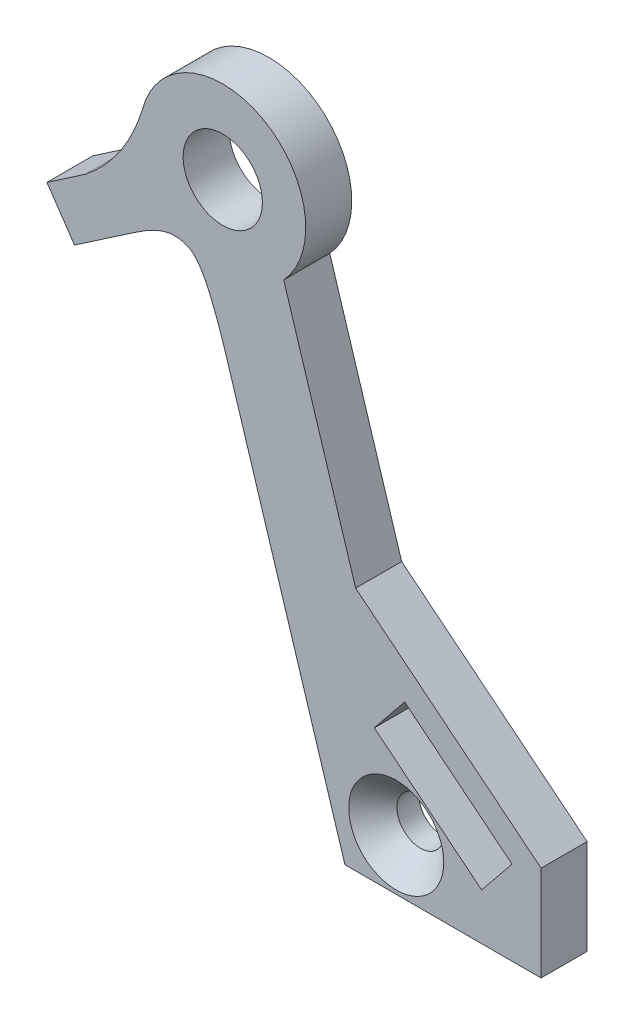
ISO-10303-21;
HEADER;
FILE_DESCRIPTION(('STEP AP214'),'2;1');
FILE_NAME('part.step','',(''),(''),'','','');
FILE_SCHEMA(('AUTOMOTIVE_DESIGN { 1 0 10303 214 1 1 1 1 }'));
ENDSEC;
DATA;
#1=APPLICATION_CONTEXT('core data for automotive mechanical design processes');
#2=APPLICATION_PROTOCOL_DEFINITION('international standard','automotive_design',2000,#1);
#3=PRODUCT_CONTEXT('',#1,'mechanical');
#4=PRODUCT('Part','Part','',(#3));
#5=PRODUCT_RELATED_PRODUCT_CATEGORY('part','',(#4));
#6=PRODUCT_DEFINITION_FORMATION('','',#4);
#7=PRODUCT_DEFINITION_CONTEXT('part definition',#1,'design');
#8=PRODUCT_DEFINITION('design','',#6,#7);
#9=PRODUCT_DEFINITION_SHAPE('','',#8);
#10=(LENGTH_UNIT() NAMED_UNIT(*) SI_UNIT(.MILLI.,.METRE.));
#11=(NAMED_UNIT(*) PLANE_ANGLE_UNIT() SI_UNIT($,.RADIAN.));
#12=(NAMED_UNIT(*) SI_UNIT($,.STERADIAN.) SOLID_ANGLE_UNIT());
#13=UNCERTAINTY_MEASURE_WITH_UNIT(LENGTH_MEASURE(1.E-05),#10,'distance_accuracy_value','');
#14=(GEOMETRIC_REPRESENTATION_CONTEXT(3) GLOBAL_UNCERTAINTY_ASSIGNED_CONTEXT((#13)) GLOBAL_UNIT_ASSIGNED_CONTEXT((#10,
#11,#12)) REPRESENTATION_CONTEXT('',''));
#15=CARTESIAN_POINT('',(0.,0.,0.));
#16=DIRECTION('',(0.,0.,1.));
#17=DIRECTION('',(1.,0.,0.));
#18=AXIS2_PLACEMENT_3D('',#15,#16,#17);
#19=CARTESIAN_POINT('',(7.09605122151095,8.7855872266326,3.05));
#20=DIRECTION('',(0.628337107087621,0.777941180203721,0.));
#21=DIRECTION('',(-0.777941180203721,0.628337107087621,0.));
#22=AXIS2_PLACEMENT_3D('',#19,#20,#21);
#23=PLANE('',#22);
#24=DIRECTION('',(0.777941180203722,-0.628337107087621,0.));
#25=VECTOR('',#24,1.);
#26=CARTESIAN_POINT('',(7.09605122151095,8.7855872266326,0.));
#27=LINE('',#26,#25);
#28=CARTESIAN_POINT('',(3.95568575976615,11.3220362534265,0.));
#29=VERTEX_POINT('',#28);
#30=CARTESIAN_POINT('',(11.0738475586302,5.57275172357473,0.));
#31=VERTEX_POINT('',#30);
#32=EDGE_CURVE('E218',#29,#31,#27,.T.);
#33=ORIENTED_EDGE('',*,*,#32,.T.);
#34=DIRECTION('',(0.,0.,-1.));
#35=VECTOR('',#34,1.);
#36=CARTESIAN_POINT('',(11.0738475586302,5.57275172357473,3.05));
#37=LINE('',#36,#35);
#38=CARTESIAN_POINT('',(11.0738475586302,5.57275172357473,3.05));
#39=VERTEX_POINT('',#38);
#40=EDGE_CURVE('E12',#39,#31,#37,.T.);
#41=ORIENTED_EDGE('',*,*,#40,.F.);
#42=DIRECTION('',(0.777941180203722,-0.628337107087621,0.));
#43=VECTOR('',#42,1.);
#44=CARTESIAN_POINT('',(7.09605122151095,8.7855872266326,3.05));
#45=LINE('',#44,#43);
#46=CARTESIAN_POINT('',(3.95568575976615,11.3220362534265,3.05));
#47=VERTEX_POINT('',#46);
#48=EDGE_CURVE('E183',#47,#39,#45,.T.);
#49=ORIENTED_EDGE('',*,*,#48,.F.);
#50=DIRECTION('',(0.,0.,-1.));
#51=VECTOR('',#50,1.);
#52=CARTESIAN_POINT('',(3.95568575976615,11.3220362534265,3.05));
#53=LINE('',#52,#51);
#54=EDGE_CURVE('E237',#47,#29,#53,.T.);
#55=ORIENTED_EDGE('',*,*,#54,.T.);
#56=EDGE_LOOP('',(#33,#41,#49,#55));
#57=FACE_BOUND('',#56,.T.);
#58=ADVANCED_FACE('F48',(#57),#23,.F.);
#59=CARTESIAN_POINT('',(3.97779633711926,-3.21283550305786,3.05));
#60=DIRECTION('',(-0.777941180203721,0.628337107087621,0.));
#61=DIRECTION('',(-0.628337107087621,-0.777941180203721,0.));
#62=AXIS2_PLACEMENT_3D('',#59,#60,#61);
#63=PLANE('',#62);
#64=DIRECTION('',(0.628337107087621,0.777941180203721,0.));
#65=VECTOR('',#64,1.);
#66=CARTESIAN_POINT('',(3.97779633711926,-3.21283550305786,0.));
#67=LINE('',#66,#65);
#68=CARTESIAN_POINT('',(9.06316881594982,3.08333994692283,0.));
#69=VERTEX_POINT('',#68);
#70=EDGE_CURVE('E173',#69,#31,#67,.T.);
#71=ORIENTED_EDGE('',*,*,#70,.F.);
#72=DIRECTION('',(0.,0.,-1.));
#73=VECTOR('',#72,1.);
#74=CARTESIAN_POINT('',(9.06316881594982,3.08333994692283,3.05));
#75=LINE('',#74,#73);
#76=CARTESIAN_POINT('',(9.06316881594982,3.08333994692283,3.05));
#77=VERTEX_POINT('',#76);
#78=EDGE_CURVE('E59',#77,#69,#75,.T.);
#79=ORIENTED_EDGE('',*,*,#78,.F.);
#80=DIRECTION('',(0.628337107087621,0.777941180203721,0.));
#81=VECTOR('',#80,1.);
#82=CARTESIAN_POINT('',(3.97779633711926,-3.21283550305786,3.05));
#83=LINE('',#82,#81);
#84=EDGE_CURVE('E171',#77,#39,#83,.T.);
#85=ORIENTED_EDGE('',*,*,#84,.T.);
#86=ORIENTED_EDGE('',*,*,#40,.T.);
#87=EDGE_LOOP('',(#71,#79,#85,#86));
#88=FACE_BOUND('',#87,.T.);
#89=ADVANCED_FACE('F169',(#88),#63,.T.);
#90=CARTESIAN_POINT('',(5.08537247883056,6.29617544998069,3.05));
#91=DIRECTION('',(-0.628337107087621,-0.777941180203721,0.));
#92=DIRECTION('',(0.777941180203722,-0.628337107087621,0.));
#93=AXIS2_PLACEMENT_3D('',#90,#91,#92);
#94=PLANE('',#93);
#95=DIRECTION('',(-0.777941180203722,0.628337107087621,0.));
#96=VECTOR('',#95,1.);
#97=CARTESIAN_POINT('',(5.08537247883056,6.29617544998069,0.));
#98=LINE('',#97,#96);
#99=CARTESIAN_POINT('',(1.94500701708577,8.83262447677456,0.));
#100=VERTEX_POINT('',#99);
#101=EDGE_CURVE('E116',#69,#100,#98,.T.);
#102=ORIENTED_EDGE('',*,*,#101,.T.);
#103=DIRECTION('',(0.,0.,-1.));
#104=VECTOR('',#103,1.);
#105=CARTESIAN_POINT('',(1.94500701708577,8.83262447677456,3.05));
#106=LINE('',#105,#104);
#107=CARTESIAN_POINT('',(1.94500701708577,8.83262447677456,3.05));
#108=VERTEX_POINT('',#107);
#109=EDGE_CURVE('E175',#108,#100,#106,.T.);
#110=ORIENTED_EDGE('',*,*,#109,.F.);
#111=DIRECTION('',(-0.777941180203722,0.628337107087621,0.));
#112=VECTOR('',#111,1.);
#113=CARTESIAN_POINT('',(5.08537247883056,6.29617544998069,3.05));
#114=LINE('',#113,#112);
#115=EDGE_CURVE('E177',#77,#108,#114,.T.);
#116=ORIENTED_EDGE('',*,*,#115,.F.);
#117=ORIENTED_EDGE('',*,*,#78,.T.);
#118=EDGE_LOOP('',(#102,#110,#116,#117));
#119=FACE_BOUND('',#118,.T.);
#120=ADVANCED_FACE('F178',(#119),#94,.F.);
#121=CARTESIAN_POINT('',(-8.09827935261583,35.2748126995721,3.05));
#122=DIRECTION('',(0.,0.,-1.));
#123=DIRECTION('',(-1.,0.,0.));
#124=AXIS2_PLACEMENT_3D('',#121,#122,#123);
#125=CYLINDRICAL_SURFACE('',#124,5.5);
#126=CARTESIAN_POINT('',(-8.09827935261583,35.2748126995721,0.));
#127=DIRECTION('',(0.,0.,1.));
#128=DIRECTION('',(1.,0.,0.));
#129=AXIS2_PLACEMENT_3D('',#126,#127,#128);
#130=CIRCLE('',#129,5.5);
#131=CARTESIAN_POINT('',(-4.05706810215108,31.5440471442045,0.));
#132=VERTEX_POINT('',#131);
#133=CARTESIAN_POINT('',(-13.4277313732238,36.6338348333276,0.));
#134=VERTEX_POINT('',#133);
#135=EDGE_CURVE('E200',#132,#134,#130,.T.);
#136=ORIENTED_EDGE('',*,*,#135,.T.);
#137=DIRECTION('',(0.,0.,-1.));
#138=VECTOR('',#137,1.);
#139=CARTESIAN_POINT('',(-13.4277313732238,36.6338348333276,3.05));
#140=LINE('',#139,#138);
#141=CARTESIAN_POINT('',(-13.4277313732238,36.6338348333276,3.05));
#142=VERTEX_POINT('',#141);
#143=EDGE_CURVE('E52',#142,#134,#140,.T.);
#144=ORIENTED_EDGE('',*,*,#143,.F.);
#145=CARTESIAN_POINT('',(-8.09827935261583,35.2748126995721,3.05));
#146=DIRECTION('',(0.,0.,1.));
#147=DIRECTION('',(1.,0.,0.));
#148=AXIS2_PLACEMENT_3D('',#145,#146,#147);
#149=CIRCLE('',#148,5.5);
#150=CARTESIAN_POINT('',(-4.05706810215108,31.5440471442045,3.05));
#151=VERTEX_POINT('',#150);
#152=EDGE_CURVE('E131',#151,#142,#149,.T.);
#153=ORIENTED_EDGE('',*,*,#152,.F.);
#154=DIRECTION('',(0.,0.,-1.));
#155=VECTOR('',#154,1.);
#156=CARTESIAN_POINT('',(-4.05706810215108,31.5440471442045,3.05));
#157=LINE('',#156,#155);
#158=EDGE_CURVE('E194',#151,#132,#157,.T.);
#159=ORIENTED_EDGE('',*,*,#158,.T.);
#160=EDGE_LOOP('',(#136,#144,#153,#159));
#161=FACE_BOUND('',#160,.T.);
#162=ADVANCED_FACE('F285',(#161),#125,.T.);
#163=CARTESIAN_POINT('',(-17.229515242306,31.0156269604002,3.05));
#164=CARTESIAN_POINT('',(-14.5142378522232,33.1421294346128,3.05));
#165=CARTESIAN_POINT('',(-13.4277313732238,36.6338348333276,3.05));
#166=B_SPLINE_CURVE_WITH_KNOTS('',2,(#163,#164,#165),.UNSPECIFIED.,.F.,.F.,(3,3),(0.,1.),.UNSPECIFIED.);
#167=DIRECTION('',(0.,0.,-1.));
#168=VECTOR('',#167,1.);
#169=SURFACE_OF_LINEAR_EXTRUSION('',#166,#168);
#170=CARTESIAN_POINT('',(-17.229515242306,31.0156269604002,0.));
#171=CARTESIAN_POINT('',(-14.5142378522232,33.1421294346128,0.));
#172=CARTESIAN_POINT('',(-13.4277313732238,36.6338348333276,0.));
#173=B_SPLINE_CURVE_WITH_KNOTS('',2,(#170,#171,#172),.UNSPECIFIED.,.F.,.F.,(3,3),(0.,1.),.UNSPECIFIED.);
#174=CARTESIAN_POINT('',(-17.229515242306,31.0156269604002,0.));
#175=VERTEX_POINT('',#174);
#176=EDGE_CURVE('E280',#175,#134,#173,.T.);
#177=ORIENTED_EDGE('',*,*,#176,.F.);
#178=DIRECTION('',(0.,0.,-1.));
#179=VECTOR('',#178,1.);
#180=CARTESIAN_POINT('',(-17.229515242306,31.0156269604002,3.05));
#181=LINE('',#180,#179);
#182=CARTESIAN_POINT('',(-17.229515242306,31.0156269604002,3.05));
#183=VERTEX_POINT('',#182);
#184=EDGE_CURVE('E268',#183,#175,#181,.T.);
#185=ORIENTED_EDGE('',*,*,#184,.F.);
#186=EDGE_CURVE('E282',#183,#142,#166,.T.);
#187=ORIENTED_EDGE('',*,*,#186,.T.);
#188=ORIENTED_EDGE('',*,*,#143,.T.);
#189=EDGE_LOOP('',(#177,#185,#187,#188));
#190=FACE_BOUND('',#189,.T.);
#191=ADVANCED_FACE('F278',(#190),#169,.T.);
#192=CARTESIAN_POINT('',(-19.904064617022,29.1920334200035,3.05));
#193=DIRECTION('',(-0.563344658679359,0.826222001363699,0.));
#194=DIRECTION('',(-0.826222001363699,-0.563344658679359,0.));
#195=AXIS2_PLACEMENT_3D('',#192,#193,#194);
#196=PLANE('',#195);
#197=DIRECTION('',(0.826222001363699,0.563344658679359,0.));
#198=VECTOR('',#197,1.);
#199=CARTESIAN_POINT('',(-19.904064617022,29.1920334200035,0.));
#200=LINE('',#199,#198);
#201=CARTESIAN_POINT('',(-19.7546004406978,29.2939428889564,0.));
#202=VERTEX_POINT('',#201);
#203=EDGE_CURVE('E292',#202,#175,#200,.T.);
#204=ORIENTED_EDGE('',*,*,#203,.F.);
#205=DIRECTION('',(0.,0.,-1.));
#206=VECTOR('',#205,1.);
#207=CARTESIAN_POINT('',(-19.7546004406978,29.2939428889564,3.05));
#208=LINE('',#207,#206);
#209=CARTESIAN_POINT('',(-19.7546004406978,29.2939428889564,3.05));
#210=VERTEX_POINT('',#209);
#211=EDGE_CURVE('E266',#210,#202,#208,.T.);
#212=ORIENTED_EDGE('',*,*,#211,.F.);
#213=DIRECTION('',(0.826222001363699,0.563344658679359,0.));
#214=VECTOR('',#213,1.);
#215=CARTESIAN_POINT('',(-19.904064617022,29.1920334200035,3.05));
#216=LINE('',#215,#214);
#217=EDGE_CURVE('E686',#210,#183,#216,.T.);
#218=ORIENTED_EDGE('',*,*,#217,.T.);
#219=ORIENTED_EDGE('',*,*,#184,.T.);
#220=EDGE_LOOP('',(#204,#212,#218,#219));
#221=FACE_BOUND('',#220,.T.);
#222=ADVANCED_FACE('F371',(#221),#196,.T.);
#223=CARTESIAN_POINT('',(0.149464176324304,0.101909468952937,3.05));
#224=DIRECTION('',(-0.826222001363697,-0.563344658679363,0.));
#225=DIRECTION('',(0.563344658679363,-0.826222001363697,0.));
#226=AXIS2_PLACEMENT_3D('',#223,#224,#225);
#227=PLANE('',#226);
#228=DIRECTION('',(-0.563344658679363,0.826222001363697,0.));
#229=VECTOR('',#228,1.);
#230=CARTESIAN_POINT('',(0.149464176324304,0.101909468952937,0.));
#231=LINE('',#230,#229);
#232=CARTESIAN_POINT('',(-17.9237302999899,26.6087213845243,0.));
#233=VERTEX_POINT('',#232);
#234=EDGE_CURVE('E295',#233,#202,#231,.T.);
#235=ORIENTED_EDGE('',*,*,#234,.F.);
#236=DIRECTION('',(0.,0.,-1.));
#237=VECTOR('',#236,1.);
#238=CARTESIAN_POINT('',(-17.9237302999899,26.6087213845243,3.05));
#239=LINE('',#238,#237);
#240=CARTESIAN_POINT('',(-17.9237302999899,26.6087213845243,3.05));
#241=VERTEX_POINT('',#240);
#242=EDGE_CURVE('E263',#241,#233,#239,.T.);
#243=ORIENTED_EDGE('',*,*,#242,.F.);
#244=DIRECTION('',(-0.563344658679363,0.826222001363697,0.));
#245=VECTOR('',#244,1.);
#246=CARTESIAN_POINT('',(0.149464176324304,0.101909468952937,3.05));
#247=LINE('',#246,#245);
#248=EDGE_CURVE('E369',#241,#210,#247,.T.);
#249=ORIENTED_EDGE('',*,*,#248,.T.);
#250=ORIENTED_EDGE('',*,*,#211,.T.);
#251=EDGE_LOOP('',(#235,#243,#249,#250));
#252=FACE_BOUND('',#251,.T.);
#253=ADVANCED_FACE('F364',(#252),#227,.T.);
#254=CARTESIAN_POINT('',(-18.0731944763141,26.5068119155715,3.05));
#255=DIRECTION('',(-0.563344658679359,0.826222001363699,0.));
#256=DIRECTION('',(-0.826222001363699,-0.563344658679359,0.));
#257=AXIS2_PLACEMENT_3D('',#254,#255,#256);
#258=PLANE('',#257);
#259=DIRECTION('',(0.826222001363699,0.563344658679359,0.));
#260=VECTOR('',#259,1.);
#261=CARTESIAN_POINT('',(-18.0731944763141,26.5068119155715,0.));
#262=LINE('',#261,#260);
#263=CARTESIAN_POINT('',(-13.9327964663291,29.3298680674071,0.));
#264=VERTEX_POINT('',#263);
#265=EDGE_CURVE('E312',#233,#264,#262,.T.);
#266=ORIENTED_EDGE('',*,*,#265,.T.);
#267=DIRECTION('',(0.,0.,-1.));
#268=VECTOR('',#267,1.);
#269=CARTESIAN_POINT('',(-13.9327964663291,29.3298680674071,3.05));
#270=LINE('',#269,#268);
#271=CARTESIAN_POINT('',(-13.9327964663291,29.3298680674071,3.05));
#272=VERTEX_POINT('',#271);
#273=EDGE_CURVE('E259',#272,#264,#270,.T.);
#274=ORIENTED_EDGE('',*,*,#273,.F.);
#275=DIRECTION('',(0.826222001363699,0.563344658679359,0.));
#276=VECTOR('',#275,1.);
#277=CARTESIAN_POINT('',(-18.0731944763141,26.5068119155715,3.05));
#278=LINE('',#277,#276);
#279=EDGE_CURVE('E417',#241,#272,#278,.T.);
#280=ORIENTED_EDGE('',*,*,#279,.F.);
#281=ORIENTED_EDGE('',*,*,#242,.T.);
#282=EDGE_LOOP('',(#266,#274,#280,#281));
#283=FACE_BOUND('',#282,.T.);
#284=ADVANCED_FACE('F378',(#283),#258,.F.);
#285=CARTESIAN_POINT('',(-13.9327964663291,29.3298680674071,3.05));
#286=CARTESIAN_POINT('',(-12.3815516922139,30.4078490959397,3.05));
#287=CARTESIAN_POINT('',(-10.6915896379359,30.7892783455832,3.05));
#288=CARTESIAN_POINT('',(-9.22359281834283,29.609717336273,3.05));
#289=CARTESIAN_POINT('',(-7.81322683059844,25.1047956235628,3.05));
#290=B_SPLINE_CURVE_WITH_KNOTS('',3,(#285,#286,#287,#288,#289),.UNSPECIFIED.,.F.,.F.,(4,1,4),
(0.,0.517103648010991,1.),.UNSPECIFIED.);
#291=DIRECTION('',(0.,0.,-1.));
#292=VECTOR('',#291,1.);
#293=SURFACE_OF_LINEAR_EXTRUSION('',#290,#292);
#294=CARTESIAN_POINT('',(-13.9327964663291,29.3298680674071,0.));
#295=CARTESIAN_POINT('',(-12.3815516922139,30.4078490959397,0.));
#296=CARTESIAN_POINT('',(-10.6915896379359,30.7892783455832,0.));
#297=CARTESIAN_POINT('',(-9.22359281834283,29.609717336273,0.));
#298=CARTESIAN_POINT('',(-7.81322683059844,25.1047956235628,0.));
#299=B_SPLINE_CURVE_WITH_KNOTS('',3,(#294,#295,#296,#297,#298),.UNSPECIFIED.,.F.,.F.,(4,1,4),
(0.,0.517103648010991,1.),.UNSPECIFIED.);
#300=CARTESIAN_POINT('',(-7.81322683059842,25.1047956235629,0.));
#301=VERTEX_POINT('',#300);
#302=EDGE_CURVE('E315',#264,#301,#299,.T.);
#303=ORIENTED_EDGE('',*,*,#302,.T.);
#304=DIRECTION('',(0.,0.,-1.));
#305=VECTOR('',#304,1.);
#306=CARTESIAN_POINT('',(-7.81322683059842,25.1047956235629,3.05));
#307=LINE('',#306,#305);
#308=CARTESIAN_POINT('',(-7.81322683059842,25.1047956235629,3.05));
#309=VERTEX_POINT('',#308);
#310=EDGE_CURVE('E256',#309,#301,#307,.T.);
#311=ORIENTED_EDGE('',*,*,#310,.F.);
#312=EDGE_CURVE('E410',#272,#309,#290,.T.);
#313=ORIENTED_EDGE('',*,*,#312,.F.);
#314=ORIENTED_EDGE('',*,*,#273,.T.);
#315=EDGE_LOOP('',(#303,#311,#313,#314));
#316=FACE_BOUND('',#315,.T.);
#317=ADVANCED_FACE('F358',(#316),#293,.F.);
#318=CARTESIAN_POINT('',(0.,0.,3.05));
#319=DIRECTION('',(-0.954826067589934,-0.297165241323311,0.));
#320=DIRECTION('',(0.297165241323311,-0.954826067589935,0.));
#321=AXIS2_PLACEMENT_3D('',#318,#319,#320);
#322=PLANE('',#321);
#323=DIRECTION('',(-0.297165241323311,0.954826067589935,0.));
#324=VECTOR('',#323,1.);
#325=CARTESIAN_POINT('',(0.,0.,0.));
#326=LINE('',#325,#324);
#327=CARTESIAN_POINT('',(0.,0.,0.));
#328=VERTEX_POINT('',#327);
#329=EDGE_CURVE('E322',#328,#301,#326,.T.);
#330=ORIENTED_EDGE('',*,*,#329,.F.);
#331=DIRECTION('',(0.,0.,-1.));
#332=VECTOR('',#331,1.);
#333=CARTESIAN_POINT('',(0.,0.,3.05));
#334=LINE('',#333,#332);
#335=CARTESIAN_POINT('',(0.,0.,3.05));
#336=VERTEX_POINT('',#335);
#337=EDGE_CURVE('E253',#336,#328,#334,.T.);
#338=ORIENTED_EDGE('',*,*,#337,.F.);
#339=DIRECTION('',(-0.297165241323311,0.954826067589935,0.));
#340=VECTOR('',#339,1.);
#341=CARTESIAN_POINT('',(0.,0.,3.05));
#342=LINE('',#341,#340);
#343=EDGE_CURVE('E355',#336,#309,#342,.T.);
#344=ORIENTED_EDGE('',*,*,#343,.T.);
#345=ORIENTED_EDGE('',*,*,#310,.T.);
#346=EDGE_LOOP('',(#330,#338,#344,#345));
#347=FACE_BOUND('',#346,.T.);
#348=ADVANCED_FACE('F351',(#347),#322,.T.);
#349=CARTESIAN_POINT('',(0.,0.,3.05));
#350=DIRECTION('',(0.,1.,0.));
#351=DIRECTION('',(-1.,0.,0.));
#352=AXIS2_PLACEMENT_3D('',#349,#350,#351);
#353=PLANE('',#352);
#354=DIRECTION('',(1.,0.,0.));
#355=VECTOR('',#354,1.);
#356=CARTESIAN_POINT('',(0.,0.,0.));
#357=LINE('',#356,#355);
#358=CARTESIAN_POINT('',(13.,0.,0.));
#359=VERTEX_POINT('',#358);
#360=EDGE_CURVE('E330',#328,#359,#357,.T.);
#361=ORIENTED_EDGE('',*,*,#360,.T.);
#362=DIRECTION('',(0.,0.,-1.));
#363=VECTOR('',#362,1.);
#364=CARTESIAN_POINT('',(13.,0.,3.05));
#365=LINE('',#364,#363);
#366=CARTESIAN_POINT('',(13.,0.,3.05));
#367=VERTEX_POINT('',#366);
#368=EDGE_CURVE('E250',#367,#359,#365,.T.);
#369=ORIENTED_EDGE('',*,*,#368,.F.);
#370=DIRECTION('',(1.,0.,0.));
#371=VECTOR('',#370,1.);
#372=CARTESIAN_POINT('',(0.,0.,3.05));
#373=LINE('',#372,#371);
#374=EDGE_CURVE('E424',#336,#367,#373,.T.);
#375=ORIENTED_EDGE('',*,*,#374,.F.);
#376=ORIENTED_EDGE('',*,*,#337,.T.);
#377=EDGE_LOOP('',(#361,#369,#375,#376));
#378=FACE_BOUND('',#377,.T.);
#379=ADVANCED_FACE('F345',(#378),#353,.F.);
#380=CARTESIAN_POINT('',(13.,0.,3.05));
#381=DIRECTION('',(1.,0.,0.));
#382=DIRECTION('',(0.,0.,-1.));
#383=AXIS2_PLACEMENT_3D('',#380,#381,#382);
#384=PLANE('',#383);
#385=DIRECTION('',(0.,-1.,0.));
#386=VECTOR('',#385,1.);
#387=CARTESIAN_POINT('',(13.,0.,0.));
#388=LINE('',#387,#386);
#389=CARTESIAN_POINT('',(13.,6.3039086153561,0.));
#390=VERTEX_POINT('',#389);
#391=EDGE_CURVE('E333',#390,#359,#388,.T.);
#392=ORIENTED_EDGE('',*,*,#391,.F.);
#393=DIRECTION('',(0.,0.,-1.));
#394=VECTOR('',#393,1.);
#395=CARTESIAN_POINT('',(13.,6.3039086153561,3.05));
#396=LINE('',#395,#394);
#397=CARTESIAN_POINT('',(13.,6.3039086153561,3.05));
#398=VERTEX_POINT('',#397);
#399=EDGE_CURVE('E247',#398,#390,#396,.T.);
#400=ORIENTED_EDGE('',*,*,#399,.F.);
#401=DIRECTION('',(0.,-1.,0.));
#402=VECTOR('',#401,1.);
#403=CARTESIAN_POINT('',(13.,0.,3.05));
#404=LINE('',#403,#402);
#405=EDGE_CURVE('E427',#398,#367,#404,.T.);
#406=ORIENTED_EDGE('',*,*,#405,.T.);
#407=ORIENTED_EDGE('',*,*,#368,.T.);
#408=EDGE_LOOP('',(#392,#400,#406,#407));
#409=FACE_BOUND('',#408,.T.);
#410=ADVANCED_FACE('F398',(#409),#384,.T.);
#411=CARTESIAN_POINT('',(8.21390698655724,10.1695991262137,3.05));
#412=DIRECTION('',(0.628337107087621,0.777941180203721,0.));
#413=DIRECTION('',(-0.777941180203721,0.628337107087621,0.));
#414=AXIS2_PLACEMENT_3D('',#411,#412,#413);
#415=PLANE('',#414);
#416=DIRECTION('',(0.777941180203721,-0.628337107087621,0.));
#417=VECTOR('',#416,1.);
#418=CARTESIAN_POINT('',(8.21390698655724,10.1695991262137,0.));
#419=LINE('',#418,#417);
#420=CARTESIAN_POINT('',(0.708529352781201,16.2316349073405,0.));
#421=VERTEX_POINT('',#420);
#422=EDGE_CURVE('E219',#421,#390,#419,.T.);
#423=ORIENTED_EDGE('',*,*,#422,.F.);
#424=DIRECTION('',(0.,0.,-1.));
#425=VECTOR('',#424,1.);
#426=CARTESIAN_POINT('',(0.708529352781201,16.2316349073405,3.05));
#427=LINE('',#426,#425);
#428=CARTESIAN_POINT('',(0.708529352781201,16.2316349073405,3.05));
#429=VERTEX_POINT('',#428);
#430=EDGE_CURVE('E244',#429,#421,#427,.T.);
#431=ORIENTED_EDGE('',*,*,#430,.F.);
#432=DIRECTION('',(0.777941180203721,-0.628337107087621,0.));
#433=VECTOR('',#432,1.);
#434=CARTESIAN_POINT('',(8.21390698655724,10.1695991262137,3.05));
#435=LINE('',#434,#433);
#436=EDGE_CURVE('E430',#429,#398,#435,.T.);
#437=ORIENTED_EDGE('',*,*,#436,.T.);
#438=ORIENTED_EDGE('',*,*,#399,.T.);
#439=EDGE_LOOP('',(#423,#431,#437,#438));
#440=FACE_BOUND('',#439,.T.);
#441=ADVANCED_FACE('F395',(#440),#415,.T.);
#442=CARTESIAN_POINT('',(-3.14036546174479,2.53644902679387,3.05));
#443=DIRECTION('',(-0.777941180203721,0.628337107087621,0.));
#444=DIRECTION('',(-0.628337107087621,-0.777941180203721,0.));
#445=AXIS2_PLACEMENT_3D('',#442,#443,#444);
#446=PLANE('',#445);
#447=DIRECTION('',(0.628337107087621,0.777941180203721,0.));
#448=VECTOR('',#447,1.);
#449=CARTESIAN_POINT('',(-3.14036546174479,2.53644902679387,0.));
#450=LINE('',#449,#448);
#451=EDGE_CURVE('E122',#100,#29,#450,.T.);
#452=ORIENTED_EDGE('',*,*,#451,.T.);
#453=ORIENTED_EDGE('',*,*,#54,.F.);
#454=DIRECTION('',(0.628337107087621,0.777941180203721,0.));
#455=VECTOR('',#454,1.);
#456=CARTESIAN_POINT('',(-3.14036546174479,2.53644902679387,3.05));
#457=LINE('',#456,#455);
#458=EDGE_CURVE('E68',#108,#47,#457,.T.);
#459=ORIENTED_EDGE('',*,*,#458,.F.);
#460=ORIENTED_EDGE('',*,*,#109,.T.);
#461=EDGE_LOOP('',(#452,#453,#459,#460));
#462=FACE_BOUND('',#461,.T.);
#463=ADVANCED_FACE('F393',(#462),#446,.F.);
#464=CARTESIAN_POINT('',(5.25154337174439,1.63440882727809,3.05));
#465=DIRECTION('',(0.954826067589937,0.297165241323304,0.));
#466=DIRECTION('',(-0.297165241323304,0.954826067589937,0.));
#467=AXIS2_PLACEMENT_3D('',#464,#465,#466);
#468=PLANE('',#467);
#469=DIRECTION('',(0.297165241323304,-0.954826067589937,0.));
#470=VECTOR('',#469,1.);
#471=CARTESIAN_POINT('',(5.25154337174439,1.63440882727809,0.));
#472=LINE('',#471,#470);
#473=EDGE_CURVE('E213',#132,#421,#472,.T.);
#474=ORIENTED_EDGE('',*,*,#473,.F.);
#475=ORIENTED_EDGE('',*,*,#158,.F.);
#476=DIRECTION('',(0.297165241323304,-0.954826067589937,0.));
#477=VECTOR('',#476,1.);
#478=CARTESIAN_POINT('',(5.25154337174439,1.63440882727809,3.05));
#479=LINE('',#478,#477);
#480=EDGE_CURVE('E188',#151,#429,#479,.T.);
#481=ORIENTED_EDGE('',*,*,#480,.T.);
#482=ORIENTED_EDGE('',*,*,#430,.T.);
#483=EDGE_LOOP('',(#474,#475,#481,#482));
#484=FACE_BOUND('',#483,.T.);
#485=ADVANCED_FACE('F390',(#484),#468,.T.);
#486=CARTESIAN_POINT('',(-8.09827935261583,35.2748126995721,3.05));
#487=DIRECTION('',(0.,0.,-1.));
#488=DIRECTION('',(-1.,0.,0.));
#489=AXIS2_PLACEMENT_3D('',#486,#487,#488);
#490=CYLINDRICAL_SURFACE('',#489,2.625);
#491=CARTESIAN_POINT('',(-8.09827935261583,35.2748126995721,3.05));
#492=DIRECTION('',(0.,0.,1.));
#493=DIRECTION('',(1.,0.,0.));
#494=AXIS2_PLACEMENT_3D('',#491,#492,#493);
#495=CIRCLE('',#494,2.625);
#496=CARTESIAN_POINT('',(-5.47327935261583,35.2748126995721,3.05));
#497=VERTEX_POINT('',#496);
#498=EDGE_CURVE('E235',#497,#497,#495,.T.);
#499=ORIENTED_EDGE('',*,*,#498,.T.);
#500=EDGE_LOOP('',(#499));
#501=FACE_BOUND('',#500,.T.);
#502=CARTESIAN_POINT('',(-8.09827935261583,35.2748126995721,0.));
#503=DIRECTION('',(0.,0.,1.));
#504=DIRECTION('',(1.,0.,0.));
#505=AXIS2_PLACEMENT_3D('',#502,#503,#504);
#506=CIRCLE('',#505,2.625);
#507=CARTESIAN_POINT('',(-5.47327935261583,35.2748126995721,0.));
#508=VERTEX_POINT('',#507);
#509=EDGE_CURVE('E195',#508,#508,#506,.T.);
#510=ORIENTED_EDGE('',*,*,#509,.F.);
#511=EDGE_LOOP('',(#510));
#512=FACE_BOUND('',#511,.T.);
#513=ADVANCED_FACE('F50',(#501,#512),#490,.F.);
#514=CARTESIAN_POINT('',(0.,0.,3.05));
#515=DIRECTION('',(0.,0.,1.));
#516=DIRECTION('',(1.,0.,0.));
#517=AXIS2_PLACEMENT_3D('',#514,#515,#516);
#518=PLANE('',#517);
#519=CARTESIAN_POINT('',(3.4,3.4,3.05));
#520=DIRECTION('',(0.,0.,1.));
#521=DIRECTION('',(1.,0.,0.));
#522=AXIS2_PLACEMENT_3D('',#519,#520,#521);
#523=CIRCLE('',#522,3.15);
#524=CARTESIAN_POINT('',(6.55,3.4,3.05));
#525=VERTEX_POINT('',#524);
#526=EDGE_CURVE('E708',#525,#525,#523,.T.);
#527=ORIENTED_EDGE('',*,*,#526,.F.);
#528=EDGE_LOOP('',(#527));
#529=FACE_BOUND('',#528,.T.);
#530=ORIENTED_EDGE('',*,*,#498,.F.);
#531=EDGE_LOOP('',(#530));
#532=FACE_BOUND('',#531,.T.);
#533=ORIENTED_EDGE('',*,*,#152,.T.);
#534=ORIENTED_EDGE('',*,*,#186,.F.);
#535=ORIENTED_EDGE('',*,*,#217,.F.);
#536=ORIENTED_EDGE('',*,*,#248,.F.);
#537=ORIENTED_EDGE('',*,*,#279,.T.);
#538=ORIENTED_EDGE('',*,*,#312,.T.);
#539=ORIENTED_EDGE('',*,*,#343,.F.);
#540=ORIENTED_EDGE('',*,*,#374,.T.);
#541=ORIENTED_EDGE('',*,*,#405,.F.);
#542=ORIENTED_EDGE('',*,*,#436,.F.);
#543=ORIENTED_EDGE('',*,*,#480,.F.);
#544=EDGE_LOOP('',(#533,#534,#535,#536,#537,#538,#539,#540,#541,#542,#543));
#545=FACE_BOUND('',#544,.T.);
#546=ORIENTED_EDGE('',*,*,#48,.T.);
#547=ORIENTED_EDGE('',*,*,#84,.F.);
#548=ORIENTED_EDGE('',*,*,#115,.T.);
#549=ORIENTED_EDGE('',*,*,#458,.T.);
#550=EDGE_LOOP('',(#546,#547,#548,#549));
#551=FACE_BOUND('',#550,.T.);
#552=ADVANCED_FACE('F181',(#529,#532,#545,#551),#518,.T.);
#553=CARTESIAN_POINT('',(0.,0.,0.));
#554=DIRECTION('',(0.,0.,1.));
#555=DIRECTION('',(1.,0.,0.));
#556=AXIS2_PLACEMENT_3D('',#553,#554,#555);
#557=PLANE('',#556);
#558=CARTESIAN_POINT('',(3.4,3.4,0.));
#559=DIRECTION('',(0.,0.,1.));
#560=DIRECTION('',(1.,0.,0.));
#561=AXIS2_PLACEMENT_3D('',#558,#559,#560);
#562=CIRCLE('',#561,1.55);
#563=CARTESIAN_POINT('',(4.95,3.4,0.));
#564=VERTEX_POINT('',#563);
#565=EDGE_CURVE('E201',#564,#564,#562,.T.);
#566=ORIENTED_EDGE('',*,*,#565,.T.);
#567=EDGE_LOOP('',(#566));
#568=FACE_BOUND('',#567,.T.);
#569=ORIENTED_EDGE('',*,*,#509,.T.);
#570=EDGE_LOOP('',(#569));
#571=FACE_BOUND('',#570,.T.);
#572=ORIENTED_EDGE('',*,*,#135,.F.);
#573=ORIENTED_EDGE('',*,*,#473,.T.);
#574=ORIENTED_EDGE('',*,*,#422,.T.);
#575=ORIENTED_EDGE('',*,*,#391,.T.);
#576=ORIENTED_EDGE('',*,*,#360,.F.);
#577=ORIENTED_EDGE('',*,*,#329,.T.);
#578=ORIENTED_EDGE('',*,*,#302,.F.);
#579=ORIENTED_EDGE('',*,*,#265,.F.);
#580=ORIENTED_EDGE('',*,*,#234,.T.);
#581=ORIENTED_EDGE('',*,*,#203,.T.);
#582=ORIENTED_EDGE('',*,*,#176,.T.);
#583=EDGE_LOOP('',(#572,#573,#574,#575,#576,#577,#578,#579,#580,#581,#582));
#584=FACE_BOUND('',#583,.T.);
#585=ORIENTED_EDGE('',*,*,#32,.F.);
#586=ORIENTED_EDGE('',*,*,#451,.F.);
#587=ORIENTED_EDGE('',*,*,#101,.F.);
#588=ORIENTED_EDGE('',*,*,#70,.T.);
#589=EDGE_LOOP('',(#585,#586,#587,#588));
#590=FACE_BOUND('',#589,.T.);
#591=ADVANCED_FACE('F289',(#568,#571,#584,#590),#557,.F.);
#592=CARTESIAN_POINT('',(3.4,3.4,3.05));
#593=DIRECTION('',(0.,0.,1.));
#594=DIRECTION('',(1.,0.,0.));
#595=AXIS2_PLACEMENT_3D('',#592,#593,#594);
#596=CYLINDRICAL_SURFACE('',#595,1.55);
#597=ORIENTED_EDGE('',*,*,#565,.F.);
#598=EDGE_LOOP('',(#597));
#599=FACE_BOUND('',#598,.T.);
#600=CARTESIAN_POINT('',(3.4,3.4,1.45));
#601=DIRECTION('',(0.,0.,1.));
#602=DIRECTION('',(1.,0.,0.));
#603=AXIS2_PLACEMENT_3D('',#600,#601,#602);
#604=CIRCLE('',#603,1.55);
#605=CARTESIAN_POINT('',(4.95,3.4,1.45));
#606=VERTEX_POINT('',#605);
#607=EDGE_CURVE('E704',#606,#606,#604,.T.);
#608=ORIENTED_EDGE('',*,*,#607,.T.);
#609=EDGE_LOOP('',(#608));
#610=FACE_BOUND('',#609,.T.);
#611=ADVANCED_FACE('F493',(#599,#610),#596,.F.);
#612=CARTESIAN_POINT('',(3.4,3.4,3.05));
#613=DIRECTION('',(0.,0.,1.));
#614=DIRECTION('',(1.,0.,0.));
#615=AXIS2_PLACEMENT_3D('',#612,#613,#614);
#616=CONICAL_SURFACE('',#615,3.15,0.785398163397448);
#617=ORIENTED_EDGE('',*,*,#607,.F.);
#618=EDGE_LOOP('',(#617));
#619=FACE_BOUND('',#618,.T.);
#620=ORIENTED_EDGE('',*,*,#526,.T.);
#621=EDGE_LOOP('',(#620));
#622=FACE_BOUND('',#621,.T.);
#623=ADVANCED_FACE('F501',(#619,#622),#616,.F.);
#624=CLOSED_SHELL('',(#58,#89,#120,#162,#191,#222,#253,#284,#317,#348,#379,#410,#441,#463,#485,
#513,#552,#591,#611,#623));
#625=MANIFOLD_SOLID_BREP('B2',#624);
#626=ADVANCED_BREP_SHAPE_REPRESENTATION('',(#18,#625),#14);
#627=SHAPE_DEFINITION_REPRESENTATION(#9,#626);
ENDSEC;
END-ISO-10303-21;
